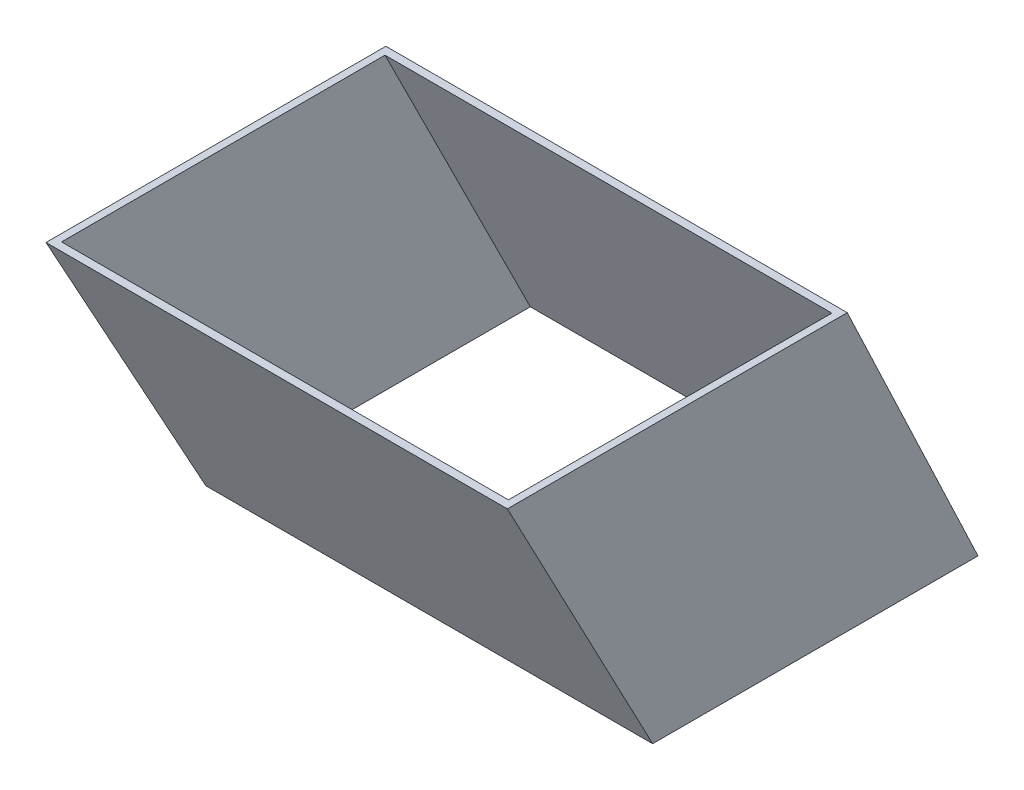
ISO-10303-21;
HEADER;
FILE_DESCRIPTION(('STEP AP214'),'2;1');
FILE_NAME('part.step','',(''),(''),'','','');
FILE_SCHEMA(('AUTOMOTIVE_DESIGN { 1 0 10303 214 1 1 1 1 }'));
ENDSEC;
DATA;
#1=APPLICATION_CONTEXT('core data for automotive mechanical design processes');
#2=APPLICATION_PROTOCOL_DEFINITION('international standard','automotive_design',2000,#1);
#3=PRODUCT_CONTEXT('',#1,'mechanical');
#4=PRODUCT('Part','Part','',(#3));
#5=PRODUCT_RELATED_PRODUCT_CATEGORY('part','',(#4));
#6=PRODUCT_DEFINITION_FORMATION('','',#4);
#7=PRODUCT_DEFINITION_CONTEXT('part definition',#1,'design');
#8=PRODUCT_DEFINITION('design','',#6,#7);
#9=PRODUCT_DEFINITION_SHAPE('','',#8);
#10=(LENGTH_UNIT() NAMED_UNIT(*) SI_UNIT(.MILLI.,.METRE.));
#11=(NAMED_UNIT(*) PLANE_ANGLE_UNIT() SI_UNIT($,.RADIAN.));
#12=(NAMED_UNIT(*) SI_UNIT($,.STERADIAN.) SOLID_ANGLE_UNIT());
#13=UNCERTAINTY_MEASURE_WITH_UNIT(LENGTH_MEASURE(1.E-05),#10,'distance_accuracy_value','');
#14=(GEOMETRIC_REPRESENTATION_CONTEXT(3) GLOBAL_UNCERTAINTY_ASSIGNED_CONTEXT((#13)) GLOBAL_UNIT_ASSIGNED_CONTEXT((#10,
#11,#12)) REPRESENTATION_CONTEXT('',''));
#15=CARTESIAN_POINT('',(0.,0.,0.));
#16=DIRECTION('',(0.,0.,1.));
#17=DIRECTION('',(1.,0.,0.));
#18=AXIS2_PLACEMENT_3D('',#15,#16,#17);
#19=CARTESIAN_POINT('',(0.,200.,0.));
#20=DIRECTION('',(0.,1.,0.));
#21=DIRECTION('',(0.,0.,1.));
#22=AXIS2_PLACEMENT_3D('',#19,#20,#21);
#23=PLANE('',#22);
#24=DIRECTION('',(0.,0.,1.));
#25=VECTOR('',#24,1.);
#26=CARTESIAN_POINT('',(0.,200.,0.));
#27=LINE('',#26,#25);
#28=CARTESIAN_POINT('',(0.,200.,-113.319830056251));
#29=VERTEX_POINT('',#28);
#30=CARTESIAN_POINT('',(0.,200.,109.293643894743));
#31=VERTEX_POINT('',#30);
#32=EDGE_CURVE('E127',#29,#31,#27,.T.);
#33=ORIENTED_EDGE('',*,*,#32,.F.);
#34=DIRECTION('',(-1.,0.,0.));
#35=VECTOR('',#34,1.);
#36=CARTESIAN_POINT('',(0.,200.,-113.319830056251));
#37=LINE('',#36,#35);
#38=CARTESIAN_POINT('',(307.533753901375,200.,-113.319830056251));
#39=VERTEX_POINT('',#38);
#40=EDGE_CURVE('E135',#39,#29,#37,.T.);
#41=ORIENTED_EDGE('',*,*,#40,.F.);
#42=DIRECTION('',(0.,0.,-1.));
#43=VECTOR('',#42,1.);
#44=CARTESIAN_POINT('',(307.533753901375,200.,0.));
#45=LINE('',#44,#43);
#46=CARTESIAN_POINT('',(307.533753901375,200.,109.293643894743));
#47=VERTEX_POINT('',#46);
#48=EDGE_CURVE('E65',#47,#39,#45,.T.);
#49=ORIENTED_EDGE('',*,*,#48,.F.);
#50=DIRECTION('',(1.,0.,0.));
#51=VECTOR('',#50,1.);
#52=CARTESIAN_POINT('',(0.,200.,109.293643894743));
#53=LINE('',#52,#51);
#54=EDGE_CURVE('E117',#31,#47,#53,.T.);
#55=ORIENTED_EDGE('',*,*,#54,.F.);
#56=EDGE_LOOP('',(#33,#41,#49,#55));
#57=FACE_BOUND('',#56,.T.);
#58=DIRECTION('',(0.,0.,1.));
#59=VECTOR('',#58,1.);
#60=CARTESIAN_POINT('',(-5.,200.,-118.91));
#61=LINE('',#60,#59);
#62=CARTESIAN_POINT('',(-5.,200.,-118.91));
#63=VERTEX_POINT('',#62);
#64=CARTESIAN_POINT('',(-4.99999999999997,200.,115.));
#65=VERTEX_POINT('',#64);
#66=EDGE_CURVE('E243',#63,#65,#61,.T.);
#67=ORIENTED_EDGE('',*,*,#66,.T.);
#68=DIRECTION('',(1.,0.,0.));
#69=VECTOR('',#68,1.);
#70=CARTESIAN_POINT('',(-4.99999999999997,200.,115.));
#71=LINE('',#70,#69);
#72=CARTESIAN_POINT('',(312.54,200.,115.));
#73=VERTEX_POINT('',#72);
#74=EDGE_CURVE('E195',#65,#73,#71,.T.);
#75=ORIENTED_EDGE('',*,*,#74,.T.);
#76=DIRECTION('',(0.,0.,-1.));
#77=VECTOR('',#76,1.);
#78=CARTESIAN_POINT('',(312.54,200.,-118.91));
#79=LINE('',#78,#77);
#80=CARTESIAN_POINT('',(312.54,200.,-118.91));
#81=VERTEX_POINT('',#80);
#82=EDGE_CURVE('E57',#73,#81,#79,.T.);
#83=ORIENTED_EDGE('',*,*,#82,.T.);
#84=DIRECTION('',(-1.,0.,0.));
#85=VECTOR('',#84,1.);
#86=CARTESIAN_POINT('',(-5.,200.,-118.91));
#87=LINE('',#86,#85);
#88=EDGE_CURVE('E12',#81,#63,#87,.T.);
#89=ORIENTED_EDGE('',*,*,#88,.T.);
#90=EDGE_LOOP('',(#67,#75,#83,#89));
#91=FACE_BOUND('',#90,.T.);
#92=ADVANCED_FACE('F47',(#57,#91),#23,.T.);
#93=CARTESIAN_POINT('',(0.,0.,0.));
#94=DIRECTION('',(0.,1.,0.));
#95=DIRECTION('',(0.,0.,1.));
#96=AXIS2_PLACEMENT_3D('',#93,#94,#95);
#97=PLANE('',#96);
#98=DIRECTION('',(0.,0.,1.));
#99=VECTOR('',#98,1.);
#100=CARTESIAN_POINT('',(0.,0.,0.));
#101=LINE('',#100,#99);
#102=CARTESIAN_POINT('',(0.,0.,-213.319830056251));
#103=VERTEX_POINT('',#102);
#104=CARTESIAN_POINT('',(0.,0.,-0.706356105256646));
#105=VERTEX_POINT('',#104);
#106=EDGE_CURVE('E123',#103,#105,#101,.T.);
#107=ORIENTED_EDGE('',*,*,#106,.T.);
#108=DIRECTION('',(1.,0.,0.));
#109=VECTOR('',#108,1.);
#110=CARTESIAN_POINT('',(0.,0.,-0.706356105256646));
#111=LINE('',#110,#109);
#112=CARTESIAN_POINT('',(297.533753901375,0.,-0.706356105256646));
#113=VERTEX_POINT('',#112);
#114=EDGE_CURVE('E119',#105,#113,#111,.T.);
#115=ORIENTED_EDGE('',*,*,#114,.T.);
#116=DIRECTION('',(0.,0.,-1.));
#117=VECTOR('',#116,1.);
#118=CARTESIAN_POINT('',(297.533753901375,0.,0.));
#119=LINE('',#118,#117);
#120=CARTESIAN_POINT('',(297.533753901375,0.,-213.319830056251));
#121=VERTEX_POINT('',#120);
#122=EDGE_CURVE('E145',#113,#121,#119,.T.);
#123=ORIENTED_EDGE('',*,*,#122,.T.);
#124=DIRECTION('',(-1.,0.,0.));
#125=VECTOR('',#124,1.);
#126=CARTESIAN_POINT('',(0.,0.,-213.319830056251));
#127=LINE('',#126,#125);
#128=EDGE_CURVE('E142',#121,#103,#127,.T.);
#129=ORIENTED_EDGE('',*,*,#128,.T.);
#130=EDGE_LOOP('',(#107,#115,#123,#129));
#131=FACE_BOUND('',#130,.T.);
#132=DIRECTION('',(1.,0.,0.));
#133=VECTOR('',#132,1.);
#134=CARTESIAN_POINT('',(-5.,0.,5.));
#135=LINE('',#134,#133);
#136=CARTESIAN_POINT('',(-5.,0.,5.));
#137=VERTEX_POINT('',#136);
#138=CARTESIAN_POINT('',(302.54,0.,5.));
#139=VERTEX_POINT('',#138);
#140=EDGE_CURVE('E140',#137,#139,#135,.T.);
#141=ORIENTED_EDGE('',*,*,#140,.F.);
#142=DIRECTION('',(0.,0.,1.));
#143=VECTOR('',#142,1.);
#144=CARTESIAN_POINT('',(-5.,0.,5.));
#145=LINE('',#144,#143);
#146=CARTESIAN_POINT('',(-5.,0.,-218.91));
#147=VERTEX_POINT('',#146);
#148=EDGE_CURVE('E154',#147,#137,#145,.T.);
#149=ORIENTED_EDGE('',*,*,#148,.F.);
#150=DIRECTION('',(-1.,0.,0.));
#151=VECTOR('',#150,1.);
#152=CARTESIAN_POINT('',(-5.,0.,-218.91));
#153=LINE('',#152,#151);
#154=CARTESIAN_POINT('',(302.54,0.,-218.91));
#155=VERTEX_POINT('',#154);
#156=EDGE_CURVE('E250',#155,#147,#153,.T.);
#157=ORIENTED_EDGE('',*,*,#156,.F.);
#158=DIRECTION('',(0.,0.,-1.));
#159=VECTOR('',#158,1.);
#160=CARTESIAN_POINT('',(302.54,0.,5.));
#161=LINE('',#160,#159);
#162=EDGE_CURVE('E232',#139,#155,#161,.T.);
#163=ORIENTED_EDGE('',*,*,#162,.F.);
#164=EDGE_LOOP('',(#141,#149,#157,#163));
#165=FACE_BOUND('',#164,.T.);
#166=ADVANCED_FACE('F173',(#131,#165),#97,.F.);
#167=CARTESIAN_POINT('',(-5.,0.,0.));
#168=DIRECTION('',(1.,0.,0.));
#169=DIRECTION('',(0.,0.,-1.));
#170=AXIS2_PLACEMENT_3D('',#167,#168,#169);
#171=PLANE('',#170);
#172=DIRECTION('',(0.,0.876215908676647,0.481918749772156));
#173=VECTOR('',#172,1.);
#174=CARTESIAN_POINT('',(-5.,0.,5.));
#175=LINE('',#174,#173);
#176=EDGE_CURVE('E311',#137,#65,#175,.T.);
#177=ORIENTED_EDGE('',*,*,#176,.T.);
#178=ORIENTED_EDGE('',*,*,#66,.F.);
#179=DIRECTION('',(0.,0.894427190999916,0.447213595499958));
#180=VECTOR('',#179,1.);
#181=CARTESIAN_POINT('',(-5.,0.,-218.91));
#182=LINE('',#181,#180);
#183=EDGE_CURVE('E160',#147,#63,#182,.T.);
#184=ORIENTED_EDGE('',*,*,#183,.F.);
#185=ORIENTED_EDGE('',*,*,#148,.T.);
#186=EDGE_LOOP('',(#177,#178,#184,#185));
#187=FACE_BOUND('',#186,.T.);
#188=ADVANCED_FACE('F162',(#187),#171,.F.);
#189=CARTESIAN_POINT('',(0.,87.564,-175.128));
#190=DIRECTION('',(0.,-0.447213595499958,0.894427190999916));
#191=DIRECTION('',(0.,-0.894427190999916,-0.447213595499958));
#192=AXIS2_PLACEMENT_3D('',#189,#190,#191);
#193=PLANE('',#192);
#194=ORIENTED_EDGE('',*,*,#183,.T.);
#195=ORIENTED_EDGE('',*,*,#88,.F.);
#196=DIRECTION('',(0.0446767051608776,0.893534103217541,0.44676705160877));
#197=VECTOR('',#196,1.);
#198=CARTESIAN_POINT('',(302.54,0.,-218.91));
#199=LINE('',#198,#197);
#200=EDGE_CURVE('E225',#155,#81,#199,.T.);
#201=ORIENTED_EDGE('',*,*,#200,.F.);
#202=ORIENTED_EDGE('',*,*,#156,.T.);
#203=EDGE_LOOP('',(#194,#195,#201,#202));
#204=FACE_BOUND('',#203,.T.);
#205=ADVANCED_FACE('F172',(#204),#193,.F.);
#206=CARTESIAN_POINT('',(0.,-2.11132437619962,3.83877159309023));
#207=DIRECTION('',(0.,0.481918749772156,-0.876215908676647));
#208=DIRECTION('',(0.,0.876215908676647,0.481918749772156));
#209=AXIS2_PLACEMENT_3D('',#206,#207,#208);
#210=PLANE('',#209);
#211=DIRECTION('',(0.0437688109532411,0.875376219064817,0.481456920485649));
#212=VECTOR('',#211,1.);
#213=CARTESIAN_POINT('',(302.54,0.,5.));
#214=LINE('',#213,#212);
#215=EDGE_CURVE('E218',#139,#73,#214,.T.);
#216=ORIENTED_EDGE('',*,*,#215,.T.);
#217=ORIENTED_EDGE('',*,*,#74,.F.);
#218=ORIENTED_EDGE('',*,*,#176,.F.);
#219=ORIENTED_EDGE('',*,*,#140,.T.);
#220=EDGE_LOOP('',(#216,#217,#218,#219));
#221=FACE_BOUND('',#220,.T.);
#222=ADVANCED_FACE('F200',(#221),#210,.F.);
#223=CARTESIAN_POINT('',(301.785536159601,-15.0892768079803,0.));
#224=DIRECTION('',(-0.998752338877845,0.0499376169438929,0.));
#225=DIRECTION('',(-0.0499376169438929,-0.998752338877845,0.));
#226=AXIS2_PLACEMENT_3D('',#223,#224,#225);
#227=PLANE('',#226);
#228=ORIENTED_EDGE('',*,*,#200,.T.);
#229=ORIENTED_EDGE('',*,*,#82,.F.);
#230=ORIENTED_EDGE('',*,*,#215,.F.);
#231=ORIENTED_EDGE('',*,*,#162,.T.);
#232=EDGE_LOOP('',(#228,#229,#230,#231));
#233=FACE_BOUND('',#232,.T.);
#234=ADVANCED_FACE('F208',(#233),#227,.F.);
#235=CARTESIAN_POINT('',(0.,0.,0.));
#236=DIRECTION('',(1.,0.,0.));
#237=DIRECTION('',(0.,0.,-1.));
#238=AXIS2_PLACEMENT_3D('',#235,#236,#237);
#239=PLANE('',#238);
#240=DIRECTION('',(0.,0.876215908676647,0.481918749772156));
#241=VECTOR('',#240,1.);
#242=CARTESIAN_POINT('',(0.,0.298269372661156,-0.54230795029301));
#243=LINE('',#242,#241);
#244=EDGE_CURVE('E112',#105,#31,#243,.T.);
#245=ORIENTED_EDGE('',*,*,#244,.F.);
#246=ORIENTED_EDGE('',*,*,#106,.F.);
#247=DIRECTION('',(0.,0.894427190999916,0.447213595499958));
#248=VECTOR('',#247,1.);
#249=CARTESIAN_POINT('',(0.,85.3279320225002,-170.655864045));
#250=LINE('',#249,#248);
#251=EDGE_CURVE('E122',#103,#29,#250,.T.);
#252=ORIENTED_EDGE('',*,*,#251,.T.);
#253=ORIENTED_EDGE('',*,*,#32,.T.);
#254=EDGE_LOOP('',(#245,#246,#252,#253));
#255=FACE_BOUND('',#254,.T.);
#256=ADVANCED_FACE('F128',(#255),#239,.T.);
#257=CARTESIAN_POINT('',(0.,85.3279320225002,-170.655864045));
#258=DIRECTION('',(0.,-0.447213595499958,0.894427190999916));
#259=DIRECTION('',(0.,-0.894427190999916,-0.447213595499958));
#260=AXIS2_PLACEMENT_3D('',#257,#258,#259);
#261=PLANE('',#260);
#262=ORIENTED_EDGE('',*,*,#251,.F.);
#263=ORIENTED_EDGE('',*,*,#128,.F.);
#264=DIRECTION('',(0.0446767051608776,0.893534103217541,0.44676705160877));
#265=VECTOR('',#264,1.);
#266=CARTESIAN_POINT('',(301.197754992515,73.2800218227995,-176.679819144851));
#267=LINE('',#266,#265);
#268=EDGE_CURVE('E69',#121,#39,#267,.T.);
#269=ORIENTED_EDGE('',*,*,#268,.T.);
#270=ORIENTED_EDGE('',*,*,#40,.T.);
#271=EDGE_LOOP('',(#262,#263,#269,#270));
#272=FACE_BOUND('',#271,.T.);
#273=ADVANCED_FACE('F361',(#272),#261,.T.);
#274=CARTESIAN_POINT('',(0.,0.298269372661156,-0.54230795029301));
#275=DIRECTION('',(0.,0.481918749772156,-0.876215908676647));
#276=DIRECTION('',(0.,0.876215908676647,0.481918749772156));
#277=AXIS2_PLACEMENT_3D('',#274,#275,#276);
#278=PLANE('',#277);
#279=DIRECTION('',(0.0437688109532414,0.875376219064817,0.481456920485649));
#280=VECTOR('',#279,1.);
#281=CARTESIAN_POINT('',(296.978650765851,-11.102062710481,-6.81249059602122));
#282=LINE('',#281,#280);
#283=EDGE_CURVE('E371',#113,#47,#282,.T.);
#284=ORIENTED_EDGE('',*,*,#283,.F.);
#285=ORIENTED_EDGE('',*,*,#114,.F.);
#286=ORIENTED_EDGE('',*,*,#244,.T.);
#287=ORIENTED_EDGE('',*,*,#54,.T.);
#288=EDGE_LOOP('',(#284,#285,#286,#287));
#289=FACE_BOUND('',#288,.T.);
#290=ADVANCED_FACE('F115',(#289),#278,.T.);
#291=CARTESIAN_POINT('',(296.791774465212,-14.8395887232608,0.));
#292=DIRECTION('',(-0.998752338877845,0.0499376169438929,0.));
#293=DIRECTION('',(-0.0499376169438929,-0.998752338877845,0.));
#294=AXIS2_PLACEMENT_3D('',#291,#292,#293);
#295=PLANE('',#294);
#296=ORIENTED_EDGE('',*,*,#268,.F.);
#297=ORIENTED_EDGE('',*,*,#122,.F.);
#298=ORIENTED_EDGE('',*,*,#283,.T.);
#299=ORIENTED_EDGE('',*,*,#48,.T.);
#300=EDGE_LOOP('',(#296,#297,#298,#299));
#301=FACE_BOUND('',#300,.T.);
#302=ADVANCED_FACE('F374',(#301),#295,.T.);
#303=CLOSED_SHELL('',(#92,#166,#188,#205,#222,#234,#256,#273,#290,#302));
#304=MANIFOLD_SOLID_BREP('B2',#303);
#305=ADVANCED_BREP_SHAPE_REPRESENTATION('',(#18,#304),#14);
#306=SHAPE_DEFINITION_REPRESENTATION(#9,#305);
ENDSEC;
END-ISO-10303-21;
